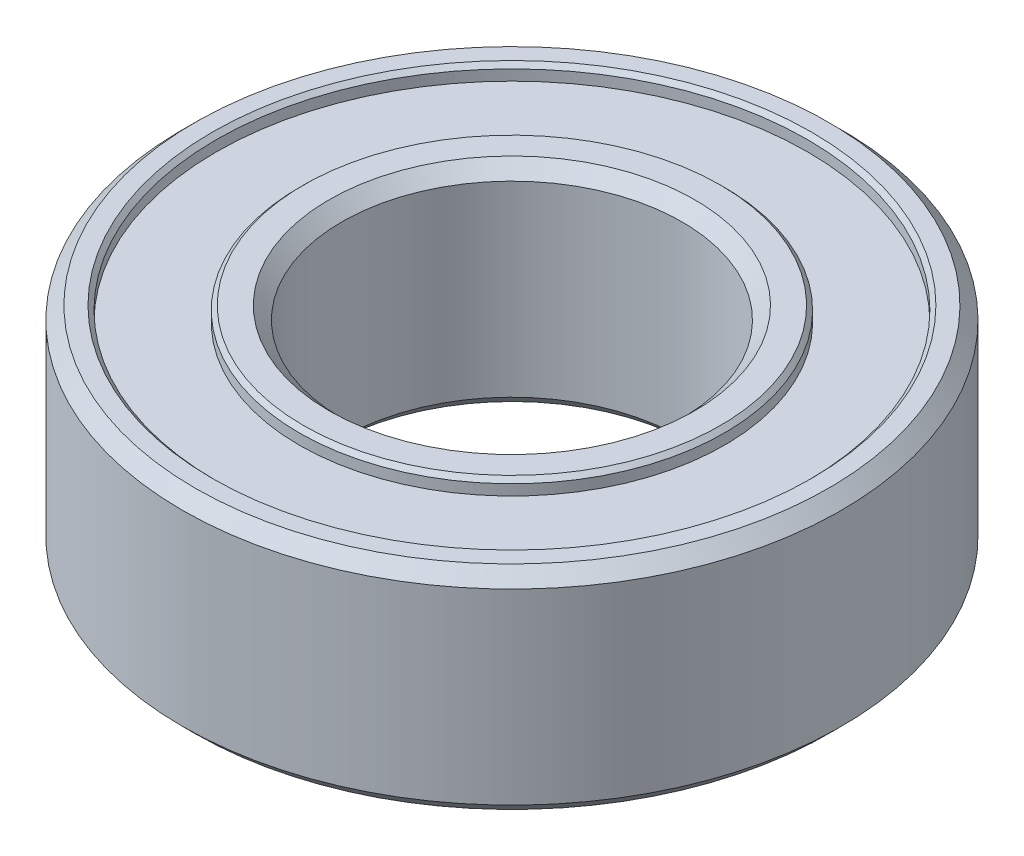
ISO-10303-21;
HEADER;
FILE_DESCRIPTION(('STEP AP214'),'2;1');
FILE_NAME('part.step','',(''),(''),'','','');
FILE_SCHEMA(('AUTOMOTIVE_DESIGN { 1 0 10303 214 1 1 1 1 }'));
ENDSEC;
DATA;
#1=APPLICATION_CONTEXT('core data for automotive mechanical design processes');
#2=APPLICATION_PROTOCOL_DEFINITION('international standard','automotive_design',2000,#1);
#3=PRODUCT_CONTEXT('',#1,'mechanical');
#4=PRODUCT('Part','Part','',(#3));
#5=PRODUCT_RELATED_PRODUCT_CATEGORY('part','',(#4));
#6=PRODUCT_DEFINITION_FORMATION('','',#4);
#7=PRODUCT_DEFINITION_CONTEXT('part definition',#1,'design');
#8=PRODUCT_DEFINITION('design','',#6,#7);
#9=PRODUCT_DEFINITION_SHAPE('','',#8);
#10=(LENGTH_UNIT() NAMED_UNIT(*) SI_UNIT(.MILLI.,.METRE.));
#11=(NAMED_UNIT(*) PLANE_ANGLE_UNIT() SI_UNIT($,.RADIAN.));
#12=(NAMED_UNIT(*) SI_UNIT($,.STERADIAN.) SOLID_ANGLE_UNIT());
#13=UNCERTAINTY_MEASURE_WITH_UNIT(LENGTH_MEASURE(1.E-05),#10,'distance_accuracy_value','');
#14=(GEOMETRIC_REPRESENTATION_CONTEXT(3) GLOBAL_UNCERTAINTY_ASSIGNED_CONTEXT((#13)) GLOBAL_UNIT_ASSIGNED_CONTEXT((#10,
#11,#12)) REPRESENTATION_CONTEXT('',''));
#15=CARTESIAN_POINT('',(0.,0.,0.));
#16=DIRECTION('',(0.,0.,1.));
#17=DIRECTION('',(1.,0.,0.));
#18=AXIS2_PLACEMENT_3D('',#15,#16,#17);
#19=CARTESIAN_POINT('',(0.,10.,0.));
#20=DIRECTION('',(0.,-1.,0.));
#21=DIRECTION('',(0.,0.,-1.));
#22=AXIS2_PLACEMENT_3D('',#19,#20,#21);
#23=CYLINDRICAL_SURFACE('',#22,13.9);
#24=CARTESIAN_POINT('',(0.,0.199999999999997,0.));
#25=DIRECTION('',(0.,1.,0.));
#26=DIRECTION('',(0.,0.,1.));
#27=AXIS2_PLACEMENT_3D('',#24,#25,#26);
#28=CIRCLE('',#27,13.9);
#29=CARTESIAN_POINT('',(0.,0.199999999999997,13.9));
#30=VERTEX_POINT('',#29);
#31=EDGE_CURVE('E86',#30,#30,#28,.F.);
#32=ORIENTED_EDGE('',*,*,#31,.T.);
#33=EDGE_LOOP('',(#32));
#34=FACE_BOUND('',#33,.T.);
#35=CARTESIAN_POINT('',(0.,0.699999999999999,0.));
#36=DIRECTION('',(0.,1.,0.));
#37=DIRECTION('',(0.,0.,1.));
#38=AXIS2_PLACEMENT_3D('',#35,#36,#37);
#39=CIRCLE('',#38,13.9);
#40=CARTESIAN_POINT('',(0.,0.699999999999999,13.9));
#41=VERTEX_POINT('',#40);
#42=EDGE_CURVE('E138',#41,#41,#39,.F.);
#43=ORIENTED_EDGE('',*,*,#42,.F.);
#44=EDGE_LOOP('',(#43));
#45=FACE_BOUND('',#44,.T.);
#46=ADVANCED_FACE('F53',(#34,#45),#23,.F.);
#47=CARTESIAN_POINT('',(0.,9.79999999999999,0.));
#48=DIRECTION('',(0.,1.,0.));
#49=DIRECTION('',(0.,0.,1.));
#50=AXIS2_PLACEMENT_3D('',#47,#48,#49);
#51=CIRCLE('',#50,13.9);
#52=CARTESIAN_POINT('',(0.,9.79999999999999,13.9));
#53=VERTEX_POINT('',#52);
#54=EDGE_CURVE('E72',#53,#53,#51,.T.);
#55=ORIENTED_EDGE('',*,*,#54,.T.);
#56=EDGE_LOOP('',(#55));
#57=FACE_BOUND('',#56,.T.);
#58=CARTESIAN_POINT('',(0.,9.3,0.));
#59=DIRECTION('',(0.,1.,0.));
#60=DIRECTION('',(0.,0.,1.));
#61=AXIS2_PLACEMENT_3D('',#58,#59,#60);
#62=CIRCLE('',#61,13.9);
#63=CARTESIAN_POINT('',(0.,9.3,13.9));
#64=VERTEX_POINT('',#63);
#65=EDGE_CURVE('E126',#64,#64,#62,.T.);
#66=ORIENTED_EDGE('',*,*,#65,.F.);
#67=EDGE_LOOP('',(#66));
#68=FACE_BOUND('',#67,.T.);
#69=ADVANCED_FACE('F147',(#57,#68),#23,.F.);
#70=CARTESIAN_POINT('',(0.,10.,0.));
#71=DIRECTION('',(0.,-1.,0.));
#72=DIRECTION('',(0.,0.,-1.));
#73=AXIS2_PLACEMENT_3D('',#70,#71,#72);
#74=CYLINDRICAL_SURFACE('',#73,15.5);
#75=CARTESIAN_POINT('',(0.,0.6,0.));
#76=DIRECTION('',(0.,1.,0.));
#77=DIRECTION('',(0.,0.,1.));
#78=AXIS2_PLACEMENT_3D('',#75,#76,#77);
#79=CIRCLE('',#78,15.5);
#80=CARTESIAN_POINT('',(0.,0.6,15.5));
#81=VERTEX_POINT('',#80);
#82=EDGE_CURVE('E118',#81,#81,#79,.T.);
#83=ORIENTED_EDGE('',*,*,#82,.T.);
#84=EDGE_LOOP('',(#83));
#85=FACE_BOUND('',#84,.T.);
#86=CARTESIAN_POINT('',(0.,9.39999999999998,0.));
#87=DIRECTION('',(0.,1.,0.));
#88=DIRECTION('',(0.,0.,1.));
#89=AXIS2_PLACEMENT_3D('',#86,#87,#88);
#90=CIRCLE('',#89,15.5);
#91=CARTESIAN_POINT('',(0.,9.39999999999998,15.5));
#92=VERTEX_POINT('',#91);
#93=EDGE_CURVE('E122',#92,#92,#90,.F.);
#94=ORIENTED_EDGE('',*,*,#93,.T.);
#95=EDGE_LOOP('',(#94));
#96=FACE_BOUND('',#95,.T.);
#97=ADVANCED_FACE('F153',(#85,#96),#74,.T.);
#98=CARTESIAN_POINT('',(0.,10.,0.));
#99=DIRECTION('',(0.,1.,0.));
#100=DIRECTION('',(0.,0.,1.));
#101=AXIS2_PLACEMENT_3D('',#98,#99,#100);
#102=PLANE('',#101);
#103=CARTESIAN_POINT('',(0.,10.,0.));
#104=DIRECTION('',(0.,1.,0.));
#105=DIRECTION('',(0.,0.,1.));
#106=AXIS2_PLACEMENT_3D('',#103,#104,#105);
#107=CIRCLE('',#106,14.1);
#108=CARTESIAN_POINT('',(0.,10.,14.1));
#109=VERTEX_POINT('',#108);
#110=EDGE_CURVE('E67',#109,#109,#107,.F.);
#111=ORIENTED_EDGE('',*,*,#110,.T.);
#112=EDGE_LOOP('',(#111));
#113=FACE_BOUND('',#112,.T.);
#114=CARTESIAN_POINT('',(0.,10.,0.));
#115=DIRECTION('',(0.,1.,0.));
#116=DIRECTION('',(0.,0.,1.));
#117=AXIS2_PLACEMENT_3D('',#114,#115,#116);
#118=CIRCLE('',#117,14.9);
#119=CARTESIAN_POINT('',(0.,10.,14.9));
#120=VERTEX_POINT('',#119);
#121=EDGE_CURVE('E94',#120,#120,#118,.T.);
#122=ORIENTED_EDGE('',*,*,#121,.T.);
#123=EDGE_LOOP('',(#122));
#124=FACE_BOUND('',#123,.T.);
#125=ADVANCED_FACE('F227',(#113,#124),#102,.T.);
#126=CARTESIAN_POINT('',(0.,0.,0.));
#127=DIRECTION('',(0.,1.,0.));
#128=DIRECTION('',(0.,0.,1.));
#129=AXIS2_PLACEMENT_3D('',#126,#127,#128);
#130=PLANE('',#129);
#131=CARTESIAN_POINT('',(0.,0.,0.));
#132=DIRECTION('',(0.,1.,0.));
#133=DIRECTION('',(0.,0.,1.));
#134=AXIS2_PLACEMENT_3D('',#131,#132,#133);
#135=CIRCLE('',#134,14.1);
#136=CARTESIAN_POINT('',(0.,0.,14.1));
#137=VERTEX_POINT('',#136);
#138=EDGE_CURVE('E90',#137,#137,#135,.T.);
#139=ORIENTED_EDGE('',*,*,#138,.T.);
#140=EDGE_LOOP('',(#139));
#141=FACE_BOUND('',#140,.T.);
#142=CARTESIAN_POINT('',(0.,0.,0.));
#143=DIRECTION('',(0.,1.,0.));
#144=DIRECTION('',(0.,0.,1.));
#145=AXIS2_PLACEMENT_3D('',#142,#143,#144);
#146=CIRCLE('',#145,14.9);
#147=CARTESIAN_POINT('',(0.,0.,14.9));
#148=VERTEX_POINT('',#147);
#149=EDGE_CURVE('E114',#148,#148,#146,.F.);
#150=ORIENTED_EDGE('',*,*,#149,.T.);
#151=EDGE_LOOP('',(#150));
#152=FACE_BOUND('',#151,.T.);
#153=ADVANCED_FACE('F218',(#141,#152),#130,.F.);
#154=CARTESIAN_POINT('',(0.,9.3,0.));
#155=DIRECTION('',(0.,1.,0.));
#156=DIRECTION('',(0.,0.,1.));
#157=AXIS2_PLACEMENT_3D('',#154,#155,#156);
#158=PLANE('',#157);
#159=CARTESIAN_POINT('',(0.,9.3,0.));
#160=DIRECTION('',(0.,1.,0.));
#161=DIRECTION('',(0.,0.,1.));
#162=AXIS2_PLACEMENT_3D('',#159,#160,#161);
#163=CIRCLE('',#162,10.);
#164=CARTESIAN_POINT('',(0.,9.3,10.));
#165=VERTEX_POINT('',#164);
#166=EDGE_CURVE('E130',#165,#165,#163,.T.);
#167=ORIENTED_EDGE('',*,*,#166,.F.);
#168=EDGE_LOOP('',(#167));
#169=FACE_BOUND('',#168,.T.);
#170=ORIENTED_EDGE('',*,*,#65,.T.);
#171=EDGE_LOOP('',(#170));
#172=FACE_BOUND('',#171,.T.);
#173=ADVANCED_FACE('F216',(#169,#172),#158,.T.);
#174=CARTESIAN_POINT('',(0.,0.7,0.));
#175=DIRECTION('',(0.,1.,0.));
#176=DIRECTION('',(0.,0.,1.));
#177=AXIS2_PLACEMENT_3D('',#174,#175,#176);
#178=PLANE('',#177);
#179=ORIENTED_EDGE('',*,*,#42,.T.);
#180=EDGE_LOOP('',(#179));
#181=FACE_BOUND('',#180,.T.);
#182=CARTESIAN_POINT('',(0.,0.699999999999999,0.));
#183=DIRECTION('',(0.,1.,0.));
#184=DIRECTION('',(0.,0.,1.));
#185=AXIS2_PLACEMENT_3D('',#182,#183,#184);
#186=CIRCLE('',#185,10.);
#187=CARTESIAN_POINT('',(0.,0.699999999999999,10.));
#188=VERTEX_POINT('',#187);
#189=EDGE_CURVE('E134',#188,#188,#186,.F.);
#190=ORIENTED_EDGE('',*,*,#189,.F.);
#191=EDGE_LOOP('',(#190));
#192=FACE_BOUND('',#191,.T.);
#193=ADVANCED_FACE('F143',(#181,#192),#178,.F.);
#194=CARTESIAN_POINT('',(0.,10.,0.));
#195=DIRECTION('',(0.,-1.,0.));
#196=DIRECTION('',(0.,0.,-1.));
#197=AXIS2_PLACEMENT_3D('',#194,#195,#196);
#198=CYLINDRICAL_SURFACE('',#197,10.);
#199=CARTESIAN_POINT('',(0.,0.200000000000007,0.));
#200=DIRECTION('',(0.,1.,0.));
#201=DIRECTION('',(0.,0.,1.));
#202=AXIS2_PLACEMENT_3D('',#199,#200,#201);
#203=CIRCLE('',#202,10.);
#204=CARTESIAN_POINT('',(0.,0.200000000000007,10.));
#205=VERTEX_POINT('',#204);
#206=EDGE_CURVE('E82',#205,#205,#203,.T.);
#207=ORIENTED_EDGE('',*,*,#206,.T.);
#208=EDGE_LOOP('',(#207));
#209=FACE_BOUND('',#208,.T.);
#210=ORIENTED_EDGE('',*,*,#189,.T.);
#211=EDGE_LOOP('',(#210));
#212=FACE_BOUND('',#211,.T.);
#213=ADVANCED_FACE('F225',(#209,#212),#198,.T.);
#214=CARTESIAN_POINT('',(0.,10.,0.));
#215=DIRECTION('',(0.,-1.,0.));
#216=DIRECTION('',(0.,0.,-1.));
#217=AXIS2_PLACEMENT_3D('',#214,#215,#216);
#218=CYLINDRICAL_SURFACE('',#217,8.);
#219=CARTESIAN_POINT('',(0.,0.6,0.));
#220=DIRECTION('',(0.,1.,0.));
#221=DIRECTION('',(0.,0.,1.));
#222=AXIS2_PLACEMENT_3D('',#219,#220,#221);
#223=CIRCLE('',#222,8.);
#224=CARTESIAN_POINT('',(0.,0.6,8.));
#225=VERTEX_POINT('',#224);
#226=EDGE_CURVE('E102',#225,#225,#223,.F.);
#227=ORIENTED_EDGE('',*,*,#226,.T.);
#228=EDGE_LOOP('',(#227));
#229=FACE_BOUND('',#228,.T.);
#230=CARTESIAN_POINT('',(0.,9.39999999999999,0.));
#231=DIRECTION('',(0.,1.,0.));
#232=DIRECTION('',(0.,0.,1.));
#233=AXIS2_PLACEMENT_3D('',#230,#231,#232);
#234=CIRCLE('',#233,8.);
#235=CARTESIAN_POINT('',(0.,9.39999999999999,8.));
#236=VERTEX_POINT('',#235);
#237=EDGE_CURVE('E106',#236,#236,#234,.T.);
#238=ORIENTED_EDGE('',*,*,#237,.T.);
#239=EDGE_LOOP('',(#238));
#240=FACE_BOUND('',#239,.T.);
#241=ADVANCED_FACE('F279',(#229,#240),#218,.F.);
#242=CARTESIAN_POINT('',(0.,9.80000000000001,0.));
#243=DIRECTION('',(0.,1.,0.));
#244=DIRECTION('',(0.,0.,1.));
#245=AXIS2_PLACEMENT_3D('',#242,#243,#244);
#246=CIRCLE('',#245,10.);
#247=CARTESIAN_POINT('',(0.,9.80000000000001,10.));
#248=VERTEX_POINT('',#247);
#249=EDGE_CURVE('E12',#248,#248,#246,.F.);
#250=ORIENTED_EDGE('',*,*,#249,.T.);
#251=EDGE_LOOP('',(#250));
#252=FACE_BOUND('',#251,.T.);
#253=ORIENTED_EDGE('',*,*,#166,.T.);
#254=EDGE_LOOP('',(#253));
#255=FACE_BOUND('',#254,.T.);
#256=ADVANCED_FACE('F282',(#252,#255),#198,.T.);
#257=CARTESIAN_POINT('',(0.,10.,0.));
#258=DIRECTION('',(0.,1.,0.));
#259=DIRECTION('',(0.,0.,1.));
#260=AXIS2_PLACEMENT_3D('',#257,#258,#259);
#261=PLANE('',#260);
#262=CARTESIAN_POINT('',(0.,10.,0.));
#263=DIRECTION('',(0.,1.,0.));
#264=DIRECTION('',(0.,0.,1.));
#265=AXIS2_PLACEMENT_3D('',#262,#263,#264);
#266=CIRCLE('',#265,9.8);
#267=CARTESIAN_POINT('',(0.,10.,9.8));
#268=VERTEX_POINT('',#267);
#269=EDGE_CURVE('E62',#268,#268,#266,.T.);
#270=ORIENTED_EDGE('',*,*,#269,.T.);
#271=EDGE_LOOP('',(#270));
#272=FACE_BOUND('',#271,.T.);
#273=CARTESIAN_POINT('',(0.,10.,0.));
#274=DIRECTION('',(0.,1.,0.));
#275=DIRECTION('',(0.,0.,1.));
#276=AXIS2_PLACEMENT_3D('',#273,#274,#275);
#277=CIRCLE('',#276,8.60000000000001);
#278=CARTESIAN_POINT('',(0.,10.,8.60000000000001));
#279=VERTEX_POINT('',#278);
#280=EDGE_CURVE('E98',#279,#279,#277,.F.);
#281=ORIENTED_EDGE('',*,*,#280,.T.);
#282=EDGE_LOOP('',(#281));
#283=FACE_BOUND('',#282,.T.);
#284=ADVANCED_FACE('F293',(#272,#283),#261,.T.);
#285=CARTESIAN_POINT('',(0.,0.,0.));
#286=DIRECTION('',(0.,1.,0.));
#287=DIRECTION('',(0.,0.,1.));
#288=AXIS2_PLACEMENT_3D('',#285,#286,#287);
#289=PLANE('',#288);
#290=CARTESIAN_POINT('',(0.,0.,0.));
#291=DIRECTION('',(0.,1.,0.));
#292=DIRECTION('',(0.,0.,1.));
#293=AXIS2_PLACEMENT_3D('',#290,#291,#292);
#294=CIRCLE('',#293,9.79999999999999);
#295=CARTESIAN_POINT('',(0.,0.,9.79999999999999));
#296=VERTEX_POINT('',#295);
#297=EDGE_CURVE('E78',#296,#296,#294,.F.);
#298=ORIENTED_EDGE('',*,*,#297,.T.);
#299=EDGE_LOOP('',(#298));
#300=FACE_BOUND('',#299,.T.);
#301=CARTESIAN_POINT('',(0.,0.,0.));
#302=DIRECTION('',(0.,1.,0.));
#303=DIRECTION('',(0.,0.,1.));
#304=AXIS2_PLACEMENT_3D('',#301,#302,#303);
#305=CIRCLE('',#304,8.6);
#306=CARTESIAN_POINT('',(0.,0.,8.6));
#307=VERTEX_POINT('',#306);
#308=EDGE_CURVE('E110',#307,#307,#305,.T.);
#309=ORIENTED_EDGE('',*,*,#308,.T.);
#310=EDGE_LOOP('',(#309));
#311=FACE_BOUND('',#310,.T.);
#312=ADVANCED_FACE('F166',(#300,#311),#289,.F.);
#313=CARTESIAN_POINT('',(0.,0.6,0.));
#314=DIRECTION('',(0.,1.,0.));
#315=DIRECTION('',(0.,0.,1.));
#316=AXIS2_PLACEMENT_3D('',#313,#314,#315);
#317=CONICAL_SURFACE('',#316,15.5,0.78539816339745);
#318=ORIENTED_EDGE('',*,*,#149,.F.);
#319=EDGE_LOOP('',(#318));
#320=FACE_BOUND('',#319,.T.);
#321=ORIENTED_EDGE('',*,*,#82,.F.);
#322=EDGE_LOOP('',(#321));
#323=FACE_BOUND('',#322,.T.);
#324=ADVANCED_FACE('F159',(#320,#323),#317,.T.);
#325=CARTESIAN_POINT('',(0.,0.,0.));
#326=DIRECTION('',(0.,-1.,0.));
#327=DIRECTION('',(0.,0.,-1.));
#328=AXIS2_PLACEMENT_3D('',#325,#326,#327);
#329=CONICAL_SURFACE('',#328,8.6,0.785398163397448);
#330=ORIENTED_EDGE('',*,*,#226,.F.);
#331=EDGE_LOOP('',(#330));
#332=FACE_BOUND('',#331,.T.);
#333=ORIENTED_EDGE('',*,*,#308,.F.);
#334=EDGE_LOOP('',(#333));
#335=FACE_BOUND('',#334,.T.);
#336=ADVANCED_FACE('F165',(#332,#335),#329,.F.);
#337=CARTESIAN_POINT('',(0.,9.39999999999999,0.));
#338=DIRECTION('',(0.,1.,0.));
#339=DIRECTION('',(0.,0.,1.));
#340=AXIS2_PLACEMENT_3D('',#337,#338,#339);
#341=CONICAL_SURFACE('',#340,8.,0.785398163397448);
#342=CARTESIAN_POINT('',(0.,10.,8.60000000000001));
#343=CARTESIAN_POINT('',(0.,9.99375,8.59375000000001));
#344=CARTESIAN_POINT('',(0.,9.9875,8.58750000000001));
#345=CARTESIAN_POINT('',(0.,9.975,8.57500000000001));
#346=CARTESIAN_POINT('',(0.,9.96875,8.56875000000001));
#347=CARTESIAN_POINT('',(0.,9.95625,8.55625000000001));
#348=CARTESIAN_POINT('',(0.,9.95,8.55000000000001));
#349=CARTESIAN_POINT('',(0.,9.9375,8.53750000000001));
#350=CARTESIAN_POINT('',(0.,9.93125,8.53125000000001));
#351=CARTESIAN_POINT('',(0.,9.91875,8.51875000000001));
#352=CARTESIAN_POINT('',(0.,9.9125,8.51250000000001));
#353=CARTESIAN_POINT('',(0.,9.9,8.50000000000001));
#354=CARTESIAN_POINT('',(0.,9.89375,8.49375000000001));
#355=CARTESIAN_POINT('',(0.,9.88125,8.48125000000001));
#356=CARTESIAN_POINT('',(0.,9.875,8.47500000000001));
#357=CARTESIAN_POINT('',(0.,9.8625,8.46250000000001));
#358=CARTESIAN_POINT('',(0.,9.85625,8.45625000000001));
#359=CARTESIAN_POINT('',(0.,9.84375,8.44375000000001));
#360=CARTESIAN_POINT('',(0.,9.8375,8.43750000000001));
#361=CARTESIAN_POINT('',(0.,9.825,8.42500000000001));
#362=CARTESIAN_POINT('',(0.,9.81875,8.41875000000001));
#363=CARTESIAN_POINT('',(0.,9.80625,8.40625000000001));
#364=CARTESIAN_POINT('',(0.,9.8,8.40000000000001));
#365=CARTESIAN_POINT('',(0.,9.7875,8.38750000000001));
#366=CARTESIAN_POINT('',(0.,9.78124999999999,8.38125));
#367=CARTESIAN_POINT('',(0.,9.76875,8.36875000000001));
#368=CARTESIAN_POINT('',(0.,9.7625,8.36250000000001));
#369=CARTESIAN_POINT('',(0.,9.74999999999999,8.35));
#370=CARTESIAN_POINT('',(0.,9.74375,8.34375000000001));
#371=CARTESIAN_POINT('',(0.,9.73125,8.33125000000001));
#372=CARTESIAN_POINT('',(0.,9.72499999999999,8.325));
#373=CARTESIAN_POINT('',(0.,9.7125,8.31250000000001));
#374=CARTESIAN_POINT('',(0.,9.70624999999999,8.30625));
#375=CARTESIAN_POINT('',(0.,9.69374999999999,8.29375));
#376=CARTESIAN_POINT('',(0.,9.68749999999999,8.2875));
#377=CARTESIAN_POINT('',(0.,9.67499999999999,8.275));
#378=CARTESIAN_POINT('',(0.,9.66874999999999,8.26875));
#379=CARTESIAN_POINT('',(0.,9.65624999999999,8.25625));
#380=CARTESIAN_POINT('',(0.,9.64999999999999,8.25));
#381=CARTESIAN_POINT('',(0.,9.63749999999999,8.2375));
#382=CARTESIAN_POINT('',(0.,9.63124999999999,8.23125));
#383=CARTESIAN_POINT('',(0.,9.61874999999999,8.21875));
#384=CARTESIAN_POINT('',(0.,9.61249999999999,8.2125));
#385=CARTESIAN_POINT('',(0.,9.59999999999999,8.2));
#386=CARTESIAN_POINT('',(0.,9.59374999999999,8.19375));
#387=CARTESIAN_POINT('',(0.,9.58124999999999,8.18125));
#388=CARTESIAN_POINT('',(0.,9.57499999999999,8.175));
#389=CARTESIAN_POINT('',(0.,9.56249999999999,8.1625));
#390=CARTESIAN_POINT('',(0.,9.55624999999999,8.15625));
#391=CARTESIAN_POINT('',(0.,9.54374999999999,8.14375));
#392=CARTESIAN_POINT('',(0.,9.53749999999999,8.1375));
#393=CARTESIAN_POINT('',(0.,9.52499999999999,8.125));
#394=CARTESIAN_POINT('',(0.,9.51874999999999,8.11875));
#395=CARTESIAN_POINT('',(0.,9.50624999999999,8.10625));
#396=CARTESIAN_POINT('',(0.,9.49999999999999,8.1));
#397=CARTESIAN_POINT('',(0.,9.48749999999999,8.0875));
#398=CARTESIAN_POINT('',(0.,9.48124999999999,8.08125));
#399=CARTESIAN_POINT('',(0.,9.46874999999999,8.06875));
#400=CARTESIAN_POINT('',(0.,9.46249999999999,8.0625));
#401=CARTESIAN_POINT('',(0.,9.44999999999999,8.05));
#402=CARTESIAN_POINT('',(0.,9.44374999999999,8.04375));
#403=CARTESIAN_POINT('',(0.,9.43124999999999,8.03125));
#404=CARTESIAN_POINT('',(0.,9.42499999999999,8.025));
#405=CARTESIAN_POINT('',(0.,9.41249999999999,8.0125));
#406=CARTESIAN_POINT('',(0.,9.40624999999999,8.00625));
#407=CARTESIAN_POINT('',(0.,9.39999999999999,8.));
#408=B_SPLINE_CURVE_WITH_KNOTS('',3,(#342,#343,#344,#345,#346,#347,#348,#349,#350,#351,#352,
#353,#354,#355,#356,#357,#358,#359,#360,#361,#362,#363,#364,#365,#366,#367,#368,#369,#370,#371,
#372,#373,#374,#375,#376,#377,#378,#379,#380,#381,#382,#383,#384,#385,#386,#387,#388,#389,#390,
#391,#392,#393,#394,#395,#396,#397,#398,#399,#400,#401,#402,#403,#404,#405,#406,#407),
.UNSPECIFIED.,.F.,.F.,(4,2,2,2,2,2,2,2,2,2,2,2,2,2,2,2,2,2,2,2,2,2,2,2,2,2,2,2,2,2,2,2,4),(0.,
0.0265165042944975,0.0530330085889926,0.0795495128834889,0.106066017177985,0.13258252147248,
0.159099025766978,0.185615530061473,0.212132034355968,0.238648538650465,0.265165042944961,
0.291681547239458,0.318198051533953,0.344714555828448,0.371231060122946,0.397747564417441,
0.424264068711936,0.450780573006433,0.477297077300928,0.503813581595426,0.530330085889921,
0.556846590184416,0.583363094478914,0.609879598773409,0.636396103067904,0.662912607362401,
0.689429111656896,0.715945615951394,0.742462120245889,0.768978624540384,0.795495128834881,
0.822011633129376,0.848528137423871),.UNSPECIFIED.);
#409=EDGE_CURVE('BSEAM173',#279,#236,#408,.T.);
#410=ORIENTED_EDGE('',*,*,#280,.F.);
#411=ORIENTED_EDGE('',*,*,#237,.F.);
#412=ORIENTED_EDGE('',*,*,#409,.T.);
#413=ORIENTED_EDGE('',*,*,#409,.F.);
#414=EDGE_LOOP('',(#410,#412,#411,#413));
#415=FACE_BOUND('',#414,.T.);
#416=ADVANCED_FACE('F173',(#415),#341,.F.);
#417=CARTESIAN_POINT('',(0.,10.,0.));
#418=DIRECTION('',(0.,-1.,0.));
#419=DIRECTION('',(0.,0.,-1.));
#420=AXIS2_PLACEMENT_3D('',#417,#418,#419);
#421=CONICAL_SURFACE('',#420,14.9,0.785398163397448);
#422=ORIENTED_EDGE('',*,*,#93,.F.);
#423=EDGE_LOOP('',(#422));
#424=FACE_BOUND('',#423,.T.);
#425=ORIENTED_EDGE('',*,*,#121,.F.);
#426=EDGE_LOOP('',(#425));
#427=FACE_BOUND('',#426,.T.);
#428=ADVANCED_FACE('F180',(#424,#427),#421,.T.);
#429=CARTESIAN_POINT('',(0.,0.,0.));
#430=DIRECTION('',(0.,-1.,0.));
#431=DIRECTION('',(0.,0.,-1.));
#432=AXIS2_PLACEMENT_3D('',#429,#430,#431);
#433=CONICAL_SURFACE('',#432,14.1,0.785398163397453);
#434=ORIENTED_EDGE('',*,*,#31,.F.);
#435=EDGE_LOOP('',(#434));
#436=FACE_BOUND('',#435,.T.);
#437=ORIENTED_EDGE('',*,*,#138,.F.);
#438=EDGE_LOOP('',(#437));
#439=FACE_BOUND('',#438,.T.);
#440=ADVANCED_FACE('F187',(#436,#439),#433,.F.);
#441=CARTESIAN_POINT('',(0.,0.200000000000007,0.));
#442=DIRECTION('',(0.,1.,0.));
#443=DIRECTION('',(0.,0.,1.));
#444=AXIS2_PLACEMENT_3D('',#441,#442,#443);
#445=CONICAL_SURFACE('',#444,10.,0.785398163397448);
#446=ORIENTED_EDGE('',*,*,#297,.F.);
#447=EDGE_LOOP('',(#446));
#448=FACE_BOUND('',#447,.T.);
#449=ORIENTED_EDGE('',*,*,#206,.F.);
#450=EDGE_LOOP('',(#449));
#451=FACE_BOUND('',#450,.T.);
#452=ADVANCED_FACE('F194',(#448,#451),#445,.T.);
#453=CARTESIAN_POINT('',(0.,9.79999999999999,0.));
#454=DIRECTION('',(0.,1.,0.));
#455=DIRECTION('',(0.,0.,1.));
#456=AXIS2_PLACEMENT_3D('',#453,#454,#455);
#457=CONICAL_SURFACE('',#456,13.9,0.785398163397427);
#458=CARTESIAN_POINT('',(0.,10.,14.1));
#459=CARTESIAN_POINT('',(0.,9.99791666666667,14.0979166666667));
#460=CARTESIAN_POINT('',(0.,9.99583333333333,14.0958333333333));
#461=CARTESIAN_POINT('',(0.,9.99166666666667,14.0916666666667));
#462=CARTESIAN_POINT('',(0.,9.98958333333333,14.0895833333333));
#463=CARTESIAN_POINT('',(0.,9.98541666666667,14.0854166666667));
#464=CARTESIAN_POINT('',(0.,9.98333333333333,14.0833333333333));
#465=CARTESIAN_POINT('',(0.,9.97916666666667,14.0791666666667));
#466=CARTESIAN_POINT('',(0.,9.97708333333333,14.0770833333333));
#467=CARTESIAN_POINT('',(0.,9.97291666666666,14.0729166666667));
#468=CARTESIAN_POINT('',(0.,9.97083333333333,14.0708333333333));
#469=CARTESIAN_POINT('',(0.,9.96666666666667,14.0666666666667));
#470=CARTESIAN_POINT('',(0.,9.96458333333333,14.0645833333333));
#471=CARTESIAN_POINT('',(0.,9.96041666666666,14.0604166666667));
#472=CARTESIAN_POINT('',(0.,9.95833333333333,14.0583333333333));
#473=CARTESIAN_POINT('',(0.,9.95416666666666,14.0541666666667));
#474=CARTESIAN_POINT('',(0.,9.95208333333333,14.0520833333333));
#475=CARTESIAN_POINT('',(0.,9.94791666666666,14.0479166666667));
#476=CARTESIAN_POINT('',(0.,9.94583333333333,14.0458333333333));
#477=CARTESIAN_POINT('',(0.,9.94166666666666,14.0416666666667));
#478=CARTESIAN_POINT('',(0.,9.93958333333333,14.0395833333333));
#479=CARTESIAN_POINT('',(0.,9.93541666666666,14.0354166666667));
#480=CARTESIAN_POINT('',(0.,9.93333333333333,14.0333333333333));
#481=CARTESIAN_POINT('',(0.,9.92916666666666,14.0291666666667));
#482=CARTESIAN_POINT('',(0.,9.92708333333333,14.0270833333333));
#483=CARTESIAN_POINT('',(0.,9.92291666666666,14.0229166666667));
#484=CARTESIAN_POINT('',(0.,9.92083333333333,14.0208333333333));
#485=CARTESIAN_POINT('',(0.,9.91666666666666,14.0166666666667));
#486=CARTESIAN_POINT('',(0.,9.91458333333333,14.0145833333333));
#487=CARTESIAN_POINT('',(0.,9.91041666666666,14.0104166666667));
#488=CARTESIAN_POINT('',(0.,9.90833333333333,14.0083333333333));
#489=CARTESIAN_POINT('',(0.,9.90416666666666,14.0041666666667));
#490=CARTESIAN_POINT('',(0.,9.90208333333333,14.0020833333333));
#491=CARTESIAN_POINT('',(0.,9.89791666666666,13.9979166666667));
#492=CARTESIAN_POINT('',(0.,9.89583333333333,13.9958333333333));
#493=CARTESIAN_POINT('',(0.,9.89166666666666,13.9916666666667));
#494=CARTESIAN_POINT('',(0.,9.88958333333333,13.9895833333333));
#495=CARTESIAN_POINT('',(0.,9.88541666666666,13.9854166666667));
#496=CARTESIAN_POINT('',(0.,9.88333333333333,13.9833333333333));
#497=CARTESIAN_POINT('',(0.,9.87916666666666,13.9791666666667));
#498=CARTESIAN_POINT('',(0.,9.87708333333333,13.9770833333333));
#499=CARTESIAN_POINT('',(0.,9.87291666666666,13.9729166666667));
#500=CARTESIAN_POINT('',(0.,9.87083333333332,13.9708333333333));
#501=CARTESIAN_POINT('',(0.,9.86666666666666,13.9666666666667));
#502=CARTESIAN_POINT('',(0.,9.86458333333333,13.9645833333333));
#503=CARTESIAN_POINT('',(0.,9.86041666666666,13.9604166666667));
#504=CARTESIAN_POINT('',(0.,9.85833333333333,13.9583333333333));
#505=CARTESIAN_POINT('',(0.,9.85416666666666,13.9541666666667));
#506=CARTESIAN_POINT('',(0.,9.85208333333332,13.9520833333333));
#507=CARTESIAN_POINT('',(0.,9.84791666666666,13.9479166666667));
#508=CARTESIAN_POINT('',(0.,9.84583333333332,13.9458333333333));
#509=CARTESIAN_POINT('',(0.,9.84166666666666,13.9416666666667));
#510=CARTESIAN_POINT('',(0.,9.83958333333332,13.9395833333333));
#511=CARTESIAN_POINT('',(0.,9.83541666666666,13.9354166666667));
#512=CARTESIAN_POINT('',(0.,9.83333333333332,13.9333333333333));
#513=CARTESIAN_POINT('',(0.,9.82916666666666,13.9291666666667));
#514=CARTESIAN_POINT('',(0.,9.82708333333332,13.9270833333333));
#515=CARTESIAN_POINT('',(0.,9.82291666666666,13.9229166666667));
#516=CARTESIAN_POINT('',(0.,9.82083333333332,13.9208333333333));
#517=CARTESIAN_POINT('',(0.,9.81666666666666,13.9166666666667));
#518=CARTESIAN_POINT('',(0.,9.81458333333332,13.9145833333333));
#519=CARTESIAN_POINT('',(0.,9.81041666666666,13.9104166666667));
#520=CARTESIAN_POINT('',(0.,9.80833333333332,13.9083333333333));
#521=CARTESIAN_POINT('',(0.,9.80416666666665,13.9041666666667));
#522=CARTESIAN_POINT('',(0.,9.80208333333332,13.9020833333333));
#523=CARTESIAN_POINT('',(0.,9.79999999999999,13.9));
#524=B_SPLINE_CURVE_WITH_KNOTS('',3,(#458,#459,#460,#461,#462,#463,#464,#465,#466,#467,#468,
#469,#470,#471,#472,#473,#474,#475,#476,#477,#478,#479,#480,#481,#482,#483,#484,#485,#486,#487,
#488,#489,#490,#491,#492,#493,#494,#495,#496,#497,#498,#499,#500,#501,#502,#503,#504,#505,#506,
#507,#508,#509,#510,#511,#512,#513,#514,#515,#516,#517,#518,#519,#520,#521,#522,#523),
.UNSPECIFIED.,.F.,.F.,(4,2,2,2,2,2,2,2,2,2,2,2,2,2,2,2,2,2,2,2,2,2,2,2,2,2,2,2,2,2,2,2,4),(0.,
0.00883883476483332,0.0176776695296654,0.0265165042944975,0.0353553390593296,0.0441941738241617,
0.0530330085889938,0.0618718433538271,0.070710678118658,0.0795495128834901,0.0883883476483222,
0.0972271824131543,0.106066017177988,0.114904851942818,0.123743686707652,0.132582521472483,
0.141421356237315,0.150260191002148,0.159099025766979,0.167937860531812,0.176776695296643,
0.185615530061477,0.194454364826309,0.203293199591141,0.212132034355973,0.220970869120804,
0.229809703885637,0.238648538650469,0.247487373415301,0.256326208180133,0.265165042944965,
0.274003877709797,0.282842712474628),.UNSPECIFIED.);
#525=EDGE_CURVE('BSEAM200',#109,#53,#524,.T.);
#526=ORIENTED_EDGE('',*,*,#110,.F.);
#527=ORIENTED_EDGE('',*,*,#54,.F.);
#528=ORIENTED_EDGE('',*,*,#525,.T.);
#529=ORIENTED_EDGE('',*,*,#525,.F.);
#530=EDGE_LOOP('',(#526,#528,#527,#529));
#531=FACE_BOUND('',#530,.T.);
#532=ADVANCED_FACE('F200',(#531),#457,.F.);
#533=CARTESIAN_POINT('',(0.,10.,0.));
#534=DIRECTION('',(0.,-1.,0.));
#535=DIRECTION('',(0.,0.,-1.));
#536=AXIS2_PLACEMENT_3D('',#533,#534,#535);
#537=CONICAL_SURFACE('',#536,9.8,0.785398163397466);
#538=ORIENTED_EDGE('',*,*,#249,.F.);
#539=EDGE_LOOP('',(#538));
#540=FACE_BOUND('',#539,.T.);
#541=ORIENTED_EDGE('',*,*,#269,.F.);
#542=EDGE_LOOP('',(#541));
#543=FACE_BOUND('',#542,.T.);
#544=ADVANCED_FACE('F56',(#540,#543),#537,.T.);
#545=CLOSED_SHELL('',(#46,#69,#97,#125,#153,#173,#193,#213,#241,#256,#284,#312,#324,#336,#416,
#428,#440,#452,#532,#544));
#546=MANIFOLD_SOLID_BREP('B2',#545);
#547=ADVANCED_BREP_SHAPE_REPRESENTATION('',(#18,#546),#14);
#548=SHAPE_DEFINITION_REPRESENTATION(#9,#547);
ENDSEC;
END-ISO-10303-21;
